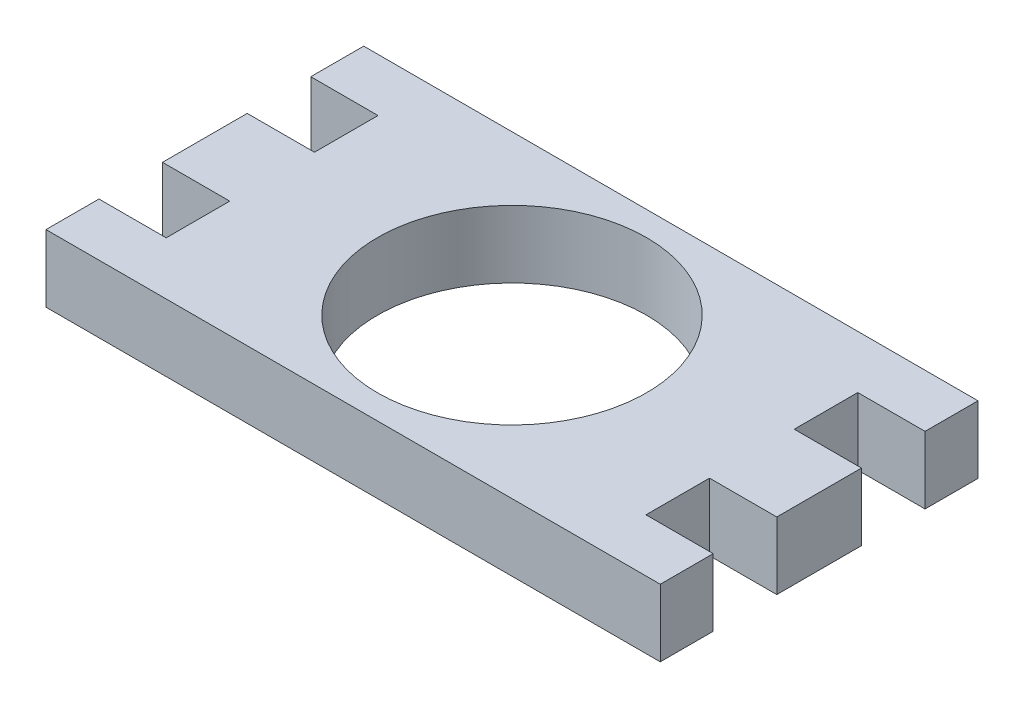
ISO-10303-21;
HEADER;
FILE_DESCRIPTION(('STEP AP214'),'2;1');
FILE_NAME('part.step','',(''),(''),'','','');
FILE_SCHEMA(('AUTOMOTIVE_DESIGN { 1 0 10303 214 1 1 1 1 }'));
ENDSEC;
DATA;
#1=APPLICATION_CONTEXT('core data for automotive mechanical design processes');
#2=APPLICATION_PROTOCOL_DEFINITION('international standard','automotive_design',2000,#1);
#3=PRODUCT_CONTEXT('',#1,'mechanical');
#4=PRODUCT('Part','Part','',(#3));
#5=PRODUCT_RELATED_PRODUCT_CATEGORY('part','',(#4));
#6=PRODUCT_DEFINITION_FORMATION('','',#4);
#7=PRODUCT_DEFINITION_CONTEXT('part definition',#1,'design');
#8=PRODUCT_DEFINITION('design','',#6,#7);
#9=PRODUCT_DEFINITION_SHAPE('','',#8);
#10=(LENGTH_UNIT() NAMED_UNIT(*) SI_UNIT(.MILLI.,.METRE.));
#11=(NAMED_UNIT(*) PLANE_ANGLE_UNIT() SI_UNIT($,.RADIAN.));
#12=(NAMED_UNIT(*) SI_UNIT($,.STERADIAN.) SOLID_ANGLE_UNIT());
#13=UNCERTAINTY_MEASURE_WITH_UNIT(LENGTH_MEASURE(1.E-05),#10,'distance_accuracy_value','');
#14=(GEOMETRIC_REPRESENTATION_CONTEXT(3) GLOBAL_UNCERTAINTY_ASSIGNED_CONTEXT((#13)) GLOBAL_UNIT_ASSIGNED_CONTEXT((#10,
#11,#12)) REPRESENTATION_CONTEXT('',''));
#15=CARTESIAN_POINT('',(0.,0.,0.));
#16=DIRECTION('',(0.,0.,1.));
#17=DIRECTION('',(1.,0.,0.));
#18=AXIS2_PLACEMENT_3D('',#15,#16,#17);
#19=CARTESIAN_POINT('',(0.,6.35,0.));
#20=DIRECTION('',(0.,1.,0.));
#21=DIRECTION('',(0.,0.,1.));
#22=AXIS2_PLACEMENT_3D('',#19,#20,#21);
#23=PLANE('',#22);
#24=DIRECTION('',(0.,0.,-1.));
#25=VECTOR('',#24,1.);
#26=CARTESIAN_POINT('',(29.,6.35,10.));
#27=LINE('',#26,#25);
#28=CARTESIAN_POINT('',(29.,6.35,15.));
#29=VERTEX_POINT('',#28);
#30=CARTESIAN_POINT('',(29.,6.35,10.));
#31=VERTEX_POINT('',#30);
#32=EDGE_CURVE('E241',#29,#31,#27,.T.);
#33=ORIENTED_EDGE('',*,*,#32,.T.);
#34=DIRECTION('',(-1.,0.,0.));
#35=VECTOR('',#34,1.);
#36=CARTESIAN_POINT('',(29.,6.35,10.));
#37=LINE('',#36,#35);
#38=CARTESIAN_POINT('',(22.65,6.35,9.99999999999999));
#39=VERTEX_POINT('',#38);
#40=EDGE_CURVE('E129',#31,#39,#37,.T.);
#41=ORIENTED_EDGE('',*,*,#40,.T.);
#42=DIRECTION('',(0.,0.,-1.));
#43=VECTOR('',#42,1.);
#44=CARTESIAN_POINT('',(22.65,6.35,9.99999999999999));
#45=LINE('',#44,#43);
#46=CARTESIAN_POINT('',(22.65,6.35,3.99999999999999));
#47=VERTEX_POINT('',#46);
#48=EDGE_CURVE('E292',#39,#47,#45,.T.);
#49=ORIENTED_EDGE('',*,*,#48,.T.);
#50=DIRECTION('',(1.,0.,0.));
#51=VECTOR('',#50,1.);
#52=CARTESIAN_POINT('',(22.65,6.35,3.99999999999999));
#53=LINE('',#52,#51);
#54=CARTESIAN_POINT('',(29.,6.35,4.00000000000001));
#55=VERTEX_POINT('',#54);
#56=EDGE_CURVE('E311',#47,#55,#53,.T.);
#57=ORIENTED_EDGE('',*,*,#56,.T.);
#58=DIRECTION('',(0.,0.,-1.));
#59=VECTOR('',#58,1.);
#60=CARTESIAN_POINT('',(29.,6.35,-4.00000000000001));
#61=LINE('',#60,#59);
#62=CARTESIAN_POINT('',(29.,6.35,-4.00000000000001));
#63=VERTEX_POINT('',#62);
#64=EDGE_CURVE('E308',#55,#63,#61,.T.);
#65=ORIENTED_EDGE('',*,*,#64,.T.);
#66=DIRECTION('',(-1.,0.,0.));
#67=VECTOR('',#66,1.);
#68=CARTESIAN_POINT('',(22.65,6.35,-3.99999999999999));
#69=LINE('',#68,#67);
#70=CARTESIAN_POINT('',(22.65,6.35,-3.99999999999999));
#71=VERTEX_POINT('',#70);
#72=EDGE_CURVE('E310',#63,#71,#69,.T.);
#73=ORIENTED_EDGE('',*,*,#72,.T.);
#74=DIRECTION('',(0.,0.,-1.));
#75=VECTOR('',#74,1.);
#76=CARTESIAN_POINT('',(22.65,6.35,-9.99999999999999));
#77=LINE('',#76,#75);
#78=CARTESIAN_POINT('',(22.65,6.35,-9.99999999999999));
#79=VERTEX_POINT('',#78);
#80=EDGE_CURVE('E313',#71,#79,#77,.T.);
#81=ORIENTED_EDGE('',*,*,#80,.T.);
#82=DIRECTION('',(1.,0.,0.));
#83=VECTOR('',#82,1.);
#84=CARTESIAN_POINT('',(29.,6.35,-10.));
#85=LINE('',#84,#83);
#86=CARTESIAN_POINT('',(29.,6.35,-10.));
#87=VERTEX_POINT('',#86);
#88=EDGE_CURVE('E319',#79,#87,#85,.T.);
#89=ORIENTED_EDGE('',*,*,#88,.T.);
#90=DIRECTION('',(0.,0.,-1.));
#91=VECTOR('',#90,1.);
#92=CARTESIAN_POINT('',(29.,6.35,-15.));
#93=LINE('',#92,#91);
#94=CARTESIAN_POINT('',(29.,6.35,-15.));
#95=VERTEX_POINT('',#94);
#96=EDGE_CURVE('E321',#87,#95,#93,.T.);
#97=ORIENTED_EDGE('',*,*,#96,.T.);
#98=DIRECTION('',(-1.,0.,0.));
#99=VECTOR('',#98,1.);
#100=CARTESIAN_POINT('',(-29.,6.35,-15.));
#101=LINE('',#100,#99);
#102=CARTESIAN_POINT('',(-29.,6.35,-15.));
#103=VERTEX_POINT('',#102);
#104=EDGE_CURVE('E323',#95,#103,#101,.T.);
#105=ORIENTED_EDGE('',*,*,#104,.T.);
#106=DIRECTION('',(0.,0.,1.));
#107=VECTOR('',#106,1.);
#108=CARTESIAN_POINT('',(-29.,6.35,-15.));
#109=LINE('',#108,#107);
#110=CARTESIAN_POINT('',(-29.,6.35,-10.));
#111=VERTEX_POINT('',#110);
#112=EDGE_CURVE('E325',#103,#111,#109,.T.);
#113=ORIENTED_EDGE('',*,*,#112,.T.);
#114=DIRECTION('',(1.,0.,0.));
#115=VECTOR('',#114,1.);
#116=CARTESIAN_POINT('',(-29.,6.35,-10.));
#117=LINE('',#116,#115);
#118=CARTESIAN_POINT('',(-22.65,6.35,-10.));
#119=VERTEX_POINT('',#118);
#120=EDGE_CURVE('E327',#111,#119,#117,.T.);
#121=ORIENTED_EDGE('',*,*,#120,.T.);
#122=DIRECTION('',(0.,0.,1.));
#123=VECTOR('',#122,1.);
#124=CARTESIAN_POINT('',(-22.65,6.35,-10.));
#125=LINE('',#124,#123);
#126=CARTESIAN_POINT('',(-22.65,6.35,-4.));
#127=VERTEX_POINT('',#126);
#128=EDGE_CURVE('E329',#119,#127,#125,.T.);
#129=ORIENTED_EDGE('',*,*,#128,.T.);
#130=DIRECTION('',(-1.,0.,0.));
#131=VECTOR('',#130,1.);
#132=CARTESIAN_POINT('',(-22.65,6.35,-4.));
#133=LINE('',#132,#131);
#134=CARTESIAN_POINT('',(-29.,6.35,-4.));
#135=VERTEX_POINT('',#134);
#136=EDGE_CURVE('E331',#127,#135,#133,.T.);
#137=ORIENTED_EDGE('',*,*,#136,.T.);
#138=DIRECTION('',(0.,0.,1.));
#139=VECTOR('',#138,1.);
#140=CARTESIAN_POINT('',(-29.,6.35,-4.));
#141=LINE('',#140,#139);
#142=CARTESIAN_POINT('',(-29.,6.35,4.));
#143=VERTEX_POINT('',#142);
#144=EDGE_CURVE('E333',#135,#143,#141,.T.);
#145=ORIENTED_EDGE('',*,*,#144,.T.);
#146=DIRECTION('',(1.,0.,0.));
#147=VECTOR('',#146,1.);
#148=CARTESIAN_POINT('',(-22.65,6.35,4.));
#149=LINE('',#148,#147);
#150=CARTESIAN_POINT('',(-22.65,6.35,4.));
#151=VERTEX_POINT('',#150);
#152=EDGE_CURVE('E335',#143,#151,#149,.T.);
#153=ORIENTED_EDGE('',*,*,#152,.T.);
#154=DIRECTION('',(0.,0.,1.));
#155=VECTOR('',#154,1.);
#156=CARTESIAN_POINT('',(-22.65,6.35,10.));
#157=LINE('',#156,#155);
#158=CARTESIAN_POINT('',(-22.65,6.35,10.));
#159=VERTEX_POINT('',#158);
#160=EDGE_CURVE('E184',#151,#159,#157,.T.);
#161=ORIENTED_EDGE('',*,*,#160,.T.);
#162=DIRECTION('',(-1.,0.,0.));
#163=VECTOR('',#162,1.);
#164=CARTESIAN_POINT('',(-29.,6.35,10.));
#165=LINE('',#164,#163);
#166=CARTESIAN_POINT('',(-29.,6.35,10.));
#167=VERTEX_POINT('',#166);
#168=EDGE_CURVE('E178',#159,#167,#165,.T.);
#169=ORIENTED_EDGE('',*,*,#168,.T.);
#170=DIRECTION('',(0.,0.,1.));
#171=VECTOR('',#170,1.);
#172=CARTESIAN_POINT('',(-29.,6.35,10.));
#173=LINE('',#172,#171);
#174=CARTESIAN_POINT('',(-29.,6.35,15.));
#175=VERTEX_POINT('',#174);
#176=EDGE_CURVE('E182',#167,#175,#173,.T.);
#177=ORIENTED_EDGE('',*,*,#176,.T.);
#178=DIRECTION('',(1.,0.,0.));
#179=VECTOR('',#178,1.);
#180=CARTESIAN_POINT('',(-29.,6.35,15.));
#181=LINE('',#180,#179);
#182=EDGE_CURVE('E50',#175,#29,#181,.T.);
#183=ORIENTED_EDGE('',*,*,#182,.T.);
#184=EDGE_LOOP('',(#33,#41,#49,#57,#65,#73,#81,#89,#97,#105,#113,#121,#129,#137,#145,#153,#161,
#169,#177,#183));
#185=FACE_BOUND('',#184,.T.);
#186=CARTESIAN_POINT('',(0.,6.35,0.));
#187=DIRECTION('',(0.,1.,0.));
#188=DIRECTION('',(0.,0.,1.));
#189=AXIS2_PLACEMENT_3D('',#186,#187,#188);
#190=CIRCLE('',#189,12.7);
#191=CARTESIAN_POINT('',(0.,6.35,12.7));
#192=VERTEX_POINT('',#191);
#193=EDGE_CURVE('E206',#192,#192,#190,.T.);
#194=ORIENTED_EDGE('',*,*,#193,.F.);
#195=EDGE_LOOP('',(#194));
#196=FACE_BOUND('',#195,.T.);
#197=ADVANCED_FACE('F33',(#185,#196),#23,.T.);
#198=CARTESIAN_POINT('',(0.,0.,0.));
#199=DIRECTION('',(0.,1.,0.));
#200=DIRECTION('',(0.,0.,1.));
#201=AXIS2_PLACEMENT_3D('',#198,#199,#200);
#202=PLANE('',#201);
#203=DIRECTION('',(0.,0.,-1.));
#204=VECTOR('',#203,1.);
#205=CARTESIAN_POINT('',(29.,0.,10.));
#206=LINE('',#205,#204);
#207=CARTESIAN_POINT('',(29.,0.,15.));
#208=VERTEX_POINT('',#207);
#209=CARTESIAN_POINT('',(29.,0.,10.));
#210=VERTEX_POINT('',#209);
#211=EDGE_CURVE('E202',#208,#210,#206,.T.);
#212=ORIENTED_EDGE('',*,*,#211,.F.);
#213=DIRECTION('',(1.,0.,0.));
#214=VECTOR('',#213,1.);
#215=CARTESIAN_POINT('',(-29.,0.,15.));
#216=LINE('',#215,#214);
#217=CARTESIAN_POINT('',(-29.,0.,15.));
#218=VERTEX_POINT('',#217);
#219=EDGE_CURVE('E121',#218,#208,#216,.T.);
#220=ORIENTED_EDGE('',*,*,#219,.F.);
#221=DIRECTION('',(0.,0.,1.));
#222=VECTOR('',#221,1.);
#223=CARTESIAN_POINT('',(-29.,0.,10.));
#224=LINE('',#223,#222);
#225=CARTESIAN_POINT('',(-29.,0.,10.));
#226=VERTEX_POINT('',#225);
#227=EDGE_CURVE('E115',#226,#218,#224,.T.);
#228=ORIENTED_EDGE('',*,*,#227,.F.);
#229=DIRECTION('',(-1.,0.,0.));
#230=VECTOR('',#229,1.);
#231=CARTESIAN_POINT('',(-29.,0.,10.));
#232=LINE('',#231,#230);
#233=CARTESIAN_POINT('',(-22.65,0.,10.));
#234=VERTEX_POINT('',#233);
#235=EDGE_CURVE('E192',#234,#226,#232,.T.);
#236=ORIENTED_EDGE('',*,*,#235,.F.);
#237=DIRECTION('',(0.,0.,1.));
#238=VECTOR('',#237,1.);
#239=CARTESIAN_POINT('',(-22.65,0.,10.));
#240=LINE('',#239,#238);
#241=CARTESIAN_POINT('',(-22.65,0.,4.));
#242=VERTEX_POINT('',#241);
#243=EDGE_CURVE('E236',#242,#234,#240,.T.);
#244=ORIENTED_EDGE('',*,*,#243,.F.);
#245=DIRECTION('',(1.,0.,0.));
#246=VECTOR('',#245,1.);
#247=CARTESIAN_POINT('',(-22.65,0.,4.));
#248=LINE('',#247,#246);
#249=CARTESIAN_POINT('',(-29.,0.,4.));
#250=VERTEX_POINT('',#249);
#251=EDGE_CURVE('E234',#250,#242,#248,.T.);
#252=ORIENTED_EDGE('',*,*,#251,.F.);
#253=DIRECTION('',(0.,0.,1.));
#254=VECTOR('',#253,1.);
#255=CARTESIAN_POINT('',(-29.,0.,-4.));
#256=LINE('',#255,#254);
#257=CARTESIAN_POINT('',(-29.,0.,-4.));
#258=VERTEX_POINT('',#257);
#259=EDGE_CURVE('E232',#258,#250,#256,.T.);
#260=ORIENTED_EDGE('',*,*,#259,.F.);
#261=DIRECTION('',(-1.,0.,0.));
#262=VECTOR('',#261,1.);
#263=CARTESIAN_POINT('',(-22.65,0.,-4.));
#264=LINE('',#263,#262);
#265=CARTESIAN_POINT('',(-22.65,0.,-4.));
#266=VERTEX_POINT('',#265);
#267=EDGE_CURVE('E230',#266,#258,#264,.T.);
#268=ORIENTED_EDGE('',*,*,#267,.F.);
#269=DIRECTION('',(0.,0.,1.));
#270=VECTOR('',#269,1.);
#271=CARTESIAN_POINT('',(-22.65,0.,-10.));
#272=LINE('',#271,#270);
#273=CARTESIAN_POINT('',(-22.65,0.,-10.));
#274=VERTEX_POINT('',#273);
#275=EDGE_CURVE('E228',#274,#266,#272,.T.);
#276=ORIENTED_EDGE('',*,*,#275,.F.);
#277=DIRECTION('',(1.,0.,0.));
#278=VECTOR('',#277,1.);
#279=CARTESIAN_POINT('',(-29.,0.,-10.));
#280=LINE('',#279,#278);
#281=CARTESIAN_POINT('',(-29.,0.,-10.));
#282=VERTEX_POINT('',#281);
#283=EDGE_CURVE('E226',#282,#274,#280,.T.);
#284=ORIENTED_EDGE('',*,*,#283,.F.);
#285=DIRECTION('',(0.,0.,1.));
#286=VECTOR('',#285,1.);
#287=CARTESIAN_POINT('',(-29.,0.,-15.));
#288=LINE('',#287,#286);
#289=CARTESIAN_POINT('',(-29.,0.,-15.));
#290=VERTEX_POINT('',#289);
#291=EDGE_CURVE('E224',#290,#282,#288,.T.);
#292=ORIENTED_EDGE('',*,*,#291,.F.);
#293=DIRECTION('',(-1.,0.,0.));
#294=VECTOR('',#293,1.);
#295=CARTESIAN_POINT('',(-29.,0.,-15.));
#296=LINE('',#295,#294);
#297=CARTESIAN_POINT('',(29.,0.,-15.));
#298=VERTEX_POINT('',#297);
#299=EDGE_CURVE('E222',#298,#290,#296,.T.);
#300=ORIENTED_EDGE('',*,*,#299,.F.);
#301=DIRECTION('',(0.,0.,-1.));
#302=VECTOR('',#301,1.);
#303=CARTESIAN_POINT('',(29.,0.,-15.));
#304=LINE('',#303,#302);
#305=CARTESIAN_POINT('',(29.,0.,-10.));
#306=VERTEX_POINT('',#305);
#307=EDGE_CURVE('E220',#306,#298,#304,.T.);
#308=ORIENTED_EDGE('',*,*,#307,.F.);
#309=DIRECTION('',(1.,0.,0.));
#310=VECTOR('',#309,1.);
#311=CARTESIAN_POINT('',(29.,0.,-10.));
#312=LINE('',#311,#310);
#313=CARTESIAN_POINT('',(22.65,0.,-9.99999999999999));
#314=VERTEX_POINT('',#313);
#315=EDGE_CURVE('E218',#314,#306,#312,.T.);
#316=ORIENTED_EDGE('',*,*,#315,.F.);
#317=DIRECTION('',(0.,0.,-1.));
#318=VECTOR('',#317,1.);
#319=CARTESIAN_POINT('',(22.65,0.,-9.99999999999999));
#320=LINE('',#319,#318);
#321=CARTESIAN_POINT('',(22.65,0.,-3.99999999999999));
#322=VERTEX_POINT('',#321);
#323=EDGE_CURVE('E216',#322,#314,#320,.T.);
#324=ORIENTED_EDGE('',*,*,#323,.F.);
#325=DIRECTION('',(-1.,0.,0.));
#326=VECTOR('',#325,1.);
#327=CARTESIAN_POINT('',(22.65,0.,-3.99999999999999));
#328=LINE('',#327,#326);
#329=CARTESIAN_POINT('',(29.,0.,-4.00000000000001));
#330=VERTEX_POINT('',#329);
#331=EDGE_CURVE('E214',#330,#322,#328,.T.);
#332=ORIENTED_EDGE('',*,*,#331,.F.);
#333=DIRECTION('',(0.,0.,-1.));
#334=VECTOR('',#333,1.);
#335=CARTESIAN_POINT('',(29.,0.,-4.00000000000001));
#336=LINE('',#335,#334);
#337=CARTESIAN_POINT('',(29.,0.,4.00000000000001));
#338=VERTEX_POINT('',#337);
#339=EDGE_CURVE('E212',#338,#330,#336,.T.);
#340=ORIENTED_EDGE('',*,*,#339,.F.);
#341=DIRECTION('',(1.,0.,0.));
#342=VECTOR('',#341,1.);
#343=CARTESIAN_POINT('',(22.65,0.,3.99999999999999));
#344=LINE('',#343,#342);
#345=CARTESIAN_POINT('',(22.65,0.,3.99999999999999));
#346=VERTEX_POINT('',#345);
#347=EDGE_CURVE('E210',#346,#338,#344,.T.);
#348=ORIENTED_EDGE('',*,*,#347,.F.);
#349=DIRECTION('',(0.,0.,-1.));
#350=VECTOR('',#349,1.);
#351=CARTESIAN_POINT('',(22.65,0.,9.99999999999999));
#352=LINE('',#351,#350);
#353=CARTESIAN_POINT('',(22.65,0.,9.99999999999999));
#354=VERTEX_POINT('',#353);
#355=EDGE_CURVE('E208',#354,#346,#352,.T.);
#356=ORIENTED_EDGE('',*,*,#355,.F.);
#357=DIRECTION('',(-1.,0.,0.));
#358=VECTOR('',#357,1.);
#359=CARTESIAN_POINT('',(29.,0.,10.));
#360=LINE('',#359,#358);
#361=EDGE_CURVE('E205',#210,#354,#360,.T.);
#362=ORIENTED_EDGE('',*,*,#361,.F.);
#363=EDGE_LOOP('',(#212,#220,#228,#236,#244,#252,#260,#268,#276,#284,#292,#300,#308,#316,#324,
#332,#340,#348,#356,#362));
#364=FACE_BOUND('',#363,.T.);
#365=CARTESIAN_POINT('',(0.,0.,0.));
#366=DIRECTION('',(0.,1.,0.));
#367=DIRECTION('',(0.,0.,1.));
#368=AXIS2_PLACEMENT_3D('',#365,#366,#367);
#369=CIRCLE('',#368,12.7);
#370=CARTESIAN_POINT('',(0.,0.,12.7));
#371=VERTEX_POINT('',#370);
#372=EDGE_CURVE('E586',#371,#371,#369,.T.);
#373=ORIENTED_EDGE('',*,*,#372,.T.);
#374=EDGE_LOOP('',(#373));
#375=FACE_BOUND('',#374,.T.);
#376=ADVANCED_FACE('F296',(#364,#375),#202,.F.);
#377=CARTESIAN_POINT('',(29.,6.35,10.));
#378=DIRECTION('',(-1.,0.,0.));
#379=DIRECTION('',(0.,0.,1.));
#380=AXIS2_PLACEMENT_3D('',#377,#378,#379);
#381=PLANE('',#380);
#382=ORIENTED_EDGE('',*,*,#211,.T.);
#383=DIRECTION('',(0.,-1.,0.));
#384=VECTOR('',#383,1.);
#385=CARTESIAN_POINT('',(29.,6.35,10.));
#386=LINE('',#385,#384);
#387=EDGE_CURVE('E11',#31,#210,#386,.T.);
#388=ORIENTED_EDGE('',*,*,#387,.F.);
#389=ORIENTED_EDGE('',*,*,#32,.F.);
#390=DIRECTION('',(0.,-1.,0.));
#391=VECTOR('',#390,1.);
#392=CARTESIAN_POINT('',(29.,6.35,15.));
#393=LINE('',#392,#391);
#394=EDGE_CURVE('E198',#29,#208,#393,.T.);
#395=ORIENTED_EDGE('',*,*,#394,.T.);
#396=EDGE_LOOP('',(#382,#388,#389,#395));
#397=FACE_BOUND('',#396,.T.);
#398=ADVANCED_FACE('F35',(#397),#381,.F.);
#399=CARTESIAN_POINT('',(29.,6.35,10.));
#400=DIRECTION('',(0.,0.,1.));
#401=DIRECTION('',(1.,0.,0.));
#402=AXIS2_PLACEMENT_3D('',#399,#400,#401);
#403=PLANE('',#402);
#404=ORIENTED_EDGE('',*,*,#361,.T.);
#405=DIRECTION('',(0.,-1.,0.));
#406=VECTOR('',#405,1.);
#407=CARTESIAN_POINT('',(22.65,6.35,9.99999999999999));
#408=LINE('',#407,#406);
#409=EDGE_CURVE('E42',#39,#354,#408,.T.);
#410=ORIENTED_EDGE('',*,*,#409,.F.);
#411=ORIENTED_EDGE('',*,*,#40,.F.);
#412=ORIENTED_EDGE('',*,*,#387,.T.);
#413=EDGE_LOOP('',(#404,#410,#411,#412));
#414=FACE_BOUND('',#413,.T.);
#415=ADVANCED_FACE('F369',(#414),#403,.F.);
#416=CARTESIAN_POINT('',(22.65,6.35,9.99999999999999));
#417=DIRECTION('',(-1.,0.,0.));
#418=DIRECTION('',(0.,0.,1.));
#419=AXIS2_PLACEMENT_3D('',#416,#417,#418);
#420=PLANE('',#419);
#421=ORIENTED_EDGE('',*,*,#355,.T.);
#422=DIRECTION('',(0.,-1.,0.));
#423=VECTOR('',#422,1.);
#424=CARTESIAN_POINT('',(22.65,6.35,3.99999999999999));
#425=LINE('',#424,#423);
#426=EDGE_CURVE('E284',#47,#346,#425,.T.);
#427=ORIENTED_EDGE('',*,*,#426,.F.);
#428=ORIENTED_EDGE('',*,*,#48,.F.);
#429=ORIENTED_EDGE('',*,*,#409,.T.);
#430=EDGE_LOOP('',(#421,#427,#428,#429));
#431=FACE_BOUND('',#430,.T.);
#432=ADVANCED_FACE('F290',(#431),#420,.F.);
#433=CARTESIAN_POINT('',(22.65,6.35,3.99999999999999));
#434=DIRECTION('',(0.,0.,-1.));
#435=DIRECTION('',(-1.,0.,0.));
#436=AXIS2_PLACEMENT_3D('',#433,#434,#435);
#437=PLANE('',#436);
#438=ORIENTED_EDGE('',*,*,#347,.T.);
#439=DIRECTION('',(0.,-1.,0.));
#440=VECTOR('',#439,1.);
#441=CARTESIAN_POINT('',(29.,6.35,4.00000000000001));
#442=LINE('',#441,#440);
#443=EDGE_CURVE('E281',#55,#338,#442,.T.);
#444=ORIENTED_EDGE('',*,*,#443,.F.);
#445=ORIENTED_EDGE('',*,*,#56,.F.);
#446=ORIENTED_EDGE('',*,*,#426,.T.);
#447=EDGE_LOOP('',(#438,#444,#445,#446));
#448=FACE_BOUND('',#447,.T.);
#449=ADVANCED_FACE('F302',(#448),#437,.F.);
#450=CARTESIAN_POINT('',(29.,6.35,-4.00000000000001));
#451=DIRECTION('',(-1.,0.,0.));
#452=DIRECTION('',(0.,0.,1.));
#453=AXIS2_PLACEMENT_3D('',#450,#451,#452);
#454=PLANE('',#453);
#455=ORIENTED_EDGE('',*,*,#339,.T.);
#456=DIRECTION('',(0.,-1.,0.));
#457=VECTOR('',#456,1.);
#458=CARTESIAN_POINT('',(29.,6.35,-4.00000000000001));
#459=LINE('',#458,#457);
#460=EDGE_CURVE('E278',#63,#330,#459,.T.);
#461=ORIENTED_EDGE('',*,*,#460,.F.);
#462=ORIENTED_EDGE('',*,*,#64,.F.);
#463=ORIENTED_EDGE('',*,*,#443,.T.);
#464=EDGE_LOOP('',(#455,#461,#462,#463));
#465=FACE_BOUND('',#464,.T.);
#466=ADVANCED_FACE('F306',(#465),#454,.F.);
#467=CARTESIAN_POINT('',(22.65,6.35,-3.99999999999999));
#468=DIRECTION('',(0.,0.,1.));
#469=DIRECTION('',(1.,0.,0.));
#470=AXIS2_PLACEMENT_3D('',#467,#468,#469);
#471=PLANE('',#470);
#472=ORIENTED_EDGE('',*,*,#331,.T.);
#473=DIRECTION('',(0.,-1.,0.));
#474=VECTOR('',#473,1.);
#475=CARTESIAN_POINT('',(22.65,6.35,-3.99999999999999));
#476=LINE('',#475,#474);
#477=EDGE_CURVE('E275',#71,#322,#476,.T.);
#478=ORIENTED_EDGE('',*,*,#477,.F.);
#479=ORIENTED_EDGE('',*,*,#72,.F.);
#480=ORIENTED_EDGE('',*,*,#460,.T.);
#481=EDGE_LOOP('',(#472,#478,#479,#480));
#482=FACE_BOUND('',#481,.T.);
#483=ADVANCED_FACE('F382',(#482),#471,.F.);
#484=CARTESIAN_POINT('',(22.65,6.35,-9.99999999999999));
#485=DIRECTION('',(-1.,0.,0.));
#486=DIRECTION('',(0.,0.,1.));
#487=AXIS2_PLACEMENT_3D('',#484,#485,#486);
#488=PLANE('',#487);
#489=ORIENTED_EDGE('',*,*,#323,.T.);
#490=DIRECTION('',(0.,-1.,0.));
#491=VECTOR('',#490,1.);
#492=CARTESIAN_POINT('',(22.65,6.35,-9.99999999999999));
#493=LINE('',#492,#491);
#494=EDGE_CURVE('E272',#79,#314,#493,.T.);
#495=ORIENTED_EDGE('',*,*,#494,.F.);
#496=ORIENTED_EDGE('',*,*,#80,.F.);
#497=ORIENTED_EDGE('',*,*,#477,.T.);
#498=EDGE_LOOP('',(#489,#495,#496,#497));
#499=FACE_BOUND('',#498,.T.);
#500=ADVANCED_FACE('F385',(#499),#488,.F.);
#501=CARTESIAN_POINT('',(29.,6.35,-10.));
#502=DIRECTION('',(0.,0.,-1.));
#503=DIRECTION('',(-1.,0.,0.));
#504=AXIS2_PLACEMENT_3D('',#501,#502,#503);
#505=PLANE('',#504);
#506=ORIENTED_EDGE('',*,*,#315,.T.);
#507=DIRECTION('',(0.,-1.,0.));
#508=VECTOR('',#507,1.);
#509=CARTESIAN_POINT('',(29.,6.35,-10.));
#510=LINE('',#509,#508);
#511=EDGE_CURVE('E269',#87,#306,#510,.T.);
#512=ORIENTED_EDGE('',*,*,#511,.F.);
#513=ORIENTED_EDGE('',*,*,#88,.F.);
#514=ORIENTED_EDGE('',*,*,#494,.T.);
#515=EDGE_LOOP('',(#506,#512,#513,#514));
#516=FACE_BOUND('',#515,.T.);
#517=ADVANCED_FACE('F389',(#516),#505,.F.);
#518=CARTESIAN_POINT('',(29.,6.35,-15.));
#519=DIRECTION('',(-1.,0.,0.));
#520=DIRECTION('',(0.,0.,1.));
#521=AXIS2_PLACEMENT_3D('',#518,#519,#520);
#522=PLANE('',#521);
#523=ORIENTED_EDGE('',*,*,#307,.T.);
#524=DIRECTION('',(0.,-1.,0.));
#525=VECTOR('',#524,1.);
#526=CARTESIAN_POINT('',(29.,6.35,-15.));
#527=LINE('',#526,#525);
#528=EDGE_CURVE('E266',#95,#298,#527,.T.);
#529=ORIENTED_EDGE('',*,*,#528,.F.);
#530=ORIENTED_EDGE('',*,*,#96,.F.);
#531=ORIENTED_EDGE('',*,*,#511,.T.);
#532=EDGE_LOOP('',(#523,#529,#530,#531));
#533=FACE_BOUND('',#532,.T.);
#534=ADVANCED_FACE('F393',(#533),#522,.F.);
#535=CARTESIAN_POINT('',(-29.,6.35,-15.));
#536=DIRECTION('',(0.,0.,1.));
#537=DIRECTION('',(1.,0.,0.));
#538=AXIS2_PLACEMENT_3D('',#535,#536,#537);
#539=PLANE('',#538);
#540=ORIENTED_EDGE('',*,*,#299,.T.);
#541=DIRECTION('',(0.,-1.,0.));
#542=VECTOR('',#541,1.);
#543=CARTESIAN_POINT('',(-29.,6.35,-15.));
#544=LINE('',#543,#542);
#545=EDGE_CURVE('E263',#103,#290,#544,.T.);
#546=ORIENTED_EDGE('',*,*,#545,.F.);
#547=ORIENTED_EDGE('',*,*,#104,.F.);
#548=ORIENTED_EDGE('',*,*,#528,.T.);
#549=EDGE_LOOP('',(#540,#546,#547,#548));
#550=FACE_BOUND('',#549,.T.);
#551=ADVANCED_FACE('F397',(#550),#539,.F.);
#552=CARTESIAN_POINT('',(-29.,6.35,-15.));
#553=DIRECTION('',(1.,0.,0.));
#554=DIRECTION('',(0.,0.,-1.));
#555=AXIS2_PLACEMENT_3D('',#552,#553,#554);
#556=PLANE('',#555);
#557=ORIENTED_EDGE('',*,*,#291,.T.);
#558=DIRECTION('',(0.,-1.,0.));
#559=VECTOR('',#558,1.);
#560=CARTESIAN_POINT('',(-29.,6.35,-10.));
#561=LINE('',#560,#559);
#562=EDGE_CURVE('E260',#111,#282,#561,.T.);
#563=ORIENTED_EDGE('',*,*,#562,.F.);
#564=ORIENTED_EDGE('',*,*,#112,.F.);
#565=ORIENTED_EDGE('',*,*,#545,.T.);
#566=EDGE_LOOP('',(#557,#563,#564,#565));
#567=FACE_BOUND('',#566,.T.);
#568=ADVANCED_FACE('F401',(#567),#556,.F.);
#569=CARTESIAN_POINT('',(-29.,6.35,-10.));
#570=DIRECTION('',(0.,0.,-1.));
#571=DIRECTION('',(-1.,0.,0.));
#572=AXIS2_PLACEMENT_3D('',#569,#570,#571);
#573=PLANE('',#572);
#574=ORIENTED_EDGE('',*,*,#283,.T.);
#575=DIRECTION('',(0.,-1.,0.));
#576=VECTOR('',#575,1.);
#577=CARTESIAN_POINT('',(-22.65,6.35,-10.));
#578=LINE('',#577,#576);
#579=EDGE_CURVE('E257',#119,#274,#578,.T.);
#580=ORIENTED_EDGE('',*,*,#579,.F.);
#581=ORIENTED_EDGE('',*,*,#120,.F.);
#582=ORIENTED_EDGE('',*,*,#562,.T.);
#583=EDGE_LOOP('',(#574,#580,#581,#582));
#584=FACE_BOUND('',#583,.T.);
#585=ADVANCED_FACE('F405',(#584),#573,.F.);
#586=CARTESIAN_POINT('',(-22.65,6.35,-10.));
#587=DIRECTION('',(1.,0.,0.));
#588=DIRECTION('',(0.,0.,-1.));
#589=AXIS2_PLACEMENT_3D('',#586,#587,#588);
#590=PLANE('',#589);
#591=ORIENTED_EDGE('',*,*,#275,.T.);
#592=DIRECTION('',(0.,-1.,0.));
#593=VECTOR('',#592,1.);
#594=CARTESIAN_POINT('',(-22.65,6.35,-4.));
#595=LINE('',#594,#593);
#596=EDGE_CURVE('E254',#127,#266,#595,.T.);
#597=ORIENTED_EDGE('',*,*,#596,.F.);
#598=ORIENTED_EDGE('',*,*,#128,.F.);
#599=ORIENTED_EDGE('',*,*,#579,.T.);
#600=EDGE_LOOP('',(#591,#597,#598,#599));
#601=FACE_BOUND('',#600,.T.);
#602=ADVANCED_FACE('F409',(#601),#590,.F.);
#603=CARTESIAN_POINT('',(-22.65,6.35,-4.));
#604=DIRECTION('',(0.,0.,1.));
#605=DIRECTION('',(1.,0.,0.));
#606=AXIS2_PLACEMENT_3D('',#603,#604,#605);
#607=PLANE('',#606);
#608=ORIENTED_EDGE('',*,*,#267,.T.);
#609=DIRECTION('',(0.,-1.,0.));
#610=VECTOR('',#609,1.);
#611=CARTESIAN_POINT('',(-29.,6.35,-4.));
#612=LINE('',#611,#610);
#613=EDGE_CURVE('E251',#135,#258,#612,.T.);
#614=ORIENTED_EDGE('',*,*,#613,.F.);
#615=ORIENTED_EDGE('',*,*,#136,.F.);
#616=ORIENTED_EDGE('',*,*,#596,.T.);
#617=EDGE_LOOP('',(#608,#614,#615,#616));
#618=FACE_BOUND('',#617,.T.);
#619=ADVANCED_FACE('F413',(#618),#607,.F.);
#620=CARTESIAN_POINT('',(-29.,6.35,-4.));
#621=DIRECTION('',(1.,0.,0.));
#622=DIRECTION('',(0.,0.,-1.));
#623=AXIS2_PLACEMENT_3D('',#620,#621,#622);
#624=PLANE('',#623);
#625=ORIENTED_EDGE('',*,*,#259,.T.);
#626=DIRECTION('',(0.,-1.,0.));
#627=VECTOR('',#626,1.);
#628=CARTESIAN_POINT('',(-29.,6.35,4.));
#629=LINE('',#628,#627);
#630=EDGE_CURVE('E248',#143,#250,#629,.T.);
#631=ORIENTED_EDGE('',*,*,#630,.F.);
#632=ORIENTED_EDGE('',*,*,#144,.F.);
#633=ORIENTED_EDGE('',*,*,#613,.T.);
#634=EDGE_LOOP('',(#625,#631,#632,#633));
#635=FACE_BOUND('',#634,.T.);
#636=ADVANCED_FACE('F417',(#635),#624,.F.);
#637=CARTESIAN_POINT('',(-22.65,6.35,4.));
#638=DIRECTION('',(0.,0.,-1.));
#639=DIRECTION('',(-1.,0.,0.));
#640=AXIS2_PLACEMENT_3D('',#637,#638,#639);
#641=PLANE('',#640);
#642=ORIENTED_EDGE('',*,*,#251,.T.);
#643=DIRECTION('',(0.,-1.,0.));
#644=VECTOR('',#643,1.);
#645=CARTESIAN_POINT('',(-22.65,6.35,4.));
#646=LINE('',#645,#644);
#647=EDGE_CURVE('E245',#151,#242,#646,.T.);
#648=ORIENTED_EDGE('',*,*,#647,.F.);
#649=ORIENTED_EDGE('',*,*,#152,.F.);
#650=ORIENTED_EDGE('',*,*,#630,.T.);
#651=EDGE_LOOP('',(#642,#648,#649,#650));
#652=FACE_BOUND('',#651,.T.);
#653=ADVANCED_FACE('F341',(#652),#641,.F.);
#654=CARTESIAN_POINT('',(-22.65,6.35,10.));
#655=DIRECTION('',(1.,0.,0.));
#656=DIRECTION('',(0.,0.,-1.));
#657=AXIS2_PLACEMENT_3D('',#654,#655,#656);
#658=PLANE('',#657);
#659=ORIENTED_EDGE('',*,*,#243,.T.);
#660=DIRECTION('',(0.,-1.,0.));
#661=VECTOR('',#660,1.);
#662=CARTESIAN_POINT('',(-22.65,6.35,10.));
#663=LINE('',#662,#661);
#664=EDGE_CURVE('E193',#159,#234,#663,.T.);
#665=ORIENTED_EDGE('',*,*,#664,.F.);
#666=ORIENTED_EDGE('',*,*,#160,.F.);
#667=ORIENTED_EDGE('',*,*,#647,.T.);
#668=EDGE_LOOP('',(#659,#665,#666,#667));
#669=FACE_BOUND('',#668,.T.);
#670=ADVANCED_FACE('F345',(#669),#658,.F.);
#671=CARTESIAN_POINT('',(-29.,6.35,10.));
#672=DIRECTION('',(0.,0.,1.));
#673=DIRECTION('',(1.,0.,0.));
#674=AXIS2_PLACEMENT_3D('',#671,#672,#673);
#675=PLANE('',#674);
#676=ORIENTED_EDGE('',*,*,#235,.T.);
#677=DIRECTION('',(0.,-1.,0.));
#678=VECTOR('',#677,1.);
#679=CARTESIAN_POINT('',(-29.,6.35,10.));
#680=LINE('',#679,#678);
#681=EDGE_CURVE('E189',#167,#226,#680,.T.);
#682=ORIENTED_EDGE('',*,*,#681,.F.);
#683=ORIENTED_EDGE('',*,*,#168,.F.);
#684=ORIENTED_EDGE('',*,*,#664,.T.);
#685=EDGE_LOOP('',(#676,#682,#683,#684));
#686=FACE_BOUND('',#685,.T.);
#687=ADVANCED_FACE('F190',(#686),#675,.F.);
#688=CARTESIAN_POINT('',(-29.,6.35,10.));
#689=DIRECTION('',(1.,0.,0.));
#690=DIRECTION('',(0.,0.,-1.));
#691=AXIS2_PLACEMENT_3D('',#688,#689,#690);
#692=PLANE('',#691);
#693=ORIENTED_EDGE('',*,*,#227,.T.);
#694=DIRECTION('',(0.,-1.,0.));
#695=VECTOR('',#694,1.);
#696=CARTESIAN_POINT('',(-29.,6.35,15.));
#697=LINE('',#696,#695);
#698=EDGE_CURVE('E194',#175,#218,#697,.T.);
#699=ORIENTED_EDGE('',*,*,#698,.F.);
#700=ORIENTED_EDGE('',*,*,#176,.F.);
#701=ORIENTED_EDGE('',*,*,#681,.T.);
#702=EDGE_LOOP('',(#693,#699,#700,#701));
#703=FACE_BOUND('',#702,.T.);
#704=ADVANCED_FACE('F196',(#703),#692,.F.);
#705=CARTESIAN_POINT('',(-29.,6.35,15.));
#706=DIRECTION('',(0.,0.,-1.));
#707=DIRECTION('',(-1.,0.,0.));
#708=AXIS2_PLACEMENT_3D('',#705,#706,#707);
#709=PLANE('',#708);
#710=ORIENTED_EDGE('',*,*,#219,.T.);
#711=ORIENTED_EDGE('',*,*,#394,.F.);
#712=ORIENTED_EDGE('',*,*,#182,.F.);
#713=ORIENTED_EDGE('',*,*,#698,.T.);
#714=EDGE_LOOP('',(#710,#711,#712,#713));
#715=FACE_BOUND('',#714,.T.);
#716=ADVANCED_FACE('F349',(#715),#709,.F.);
#717=CARTESIAN_POINT('',(0.,6.35,0.));
#718=DIRECTION('',(0.,-1.,0.));
#719=DIRECTION('',(0.,0.,-1.));
#720=AXIS2_PLACEMENT_3D('',#717,#718,#719);
#721=CYLINDRICAL_SURFACE('',#720,12.7);
#722=ORIENTED_EDGE('',*,*,#193,.T.);
#723=EDGE_LOOP('',(#722));
#724=FACE_BOUND('',#723,.T.);
#725=ORIENTED_EDGE('',*,*,#372,.F.);
#726=EDGE_LOOP('',(#725));
#727=FACE_BOUND('',#726,.T.);
#728=ADVANCED_FACE('F351',(#724,#727),#721,.F.);
#729=CLOSED_SHELL('',(#197,#376,#398,#415,#432,#449,#466,#483,#500,#517,#534,#551,#568,#585,
#602,#619,#636,#653,#670,#687,#704,#716,#728));
#730=MANIFOLD_SOLID_BREP('B2',#729);
#731=ADVANCED_BREP_SHAPE_REPRESENTATION('',(#18,#730),#14);
#732=SHAPE_DEFINITION_REPRESENTATION(#9,#731);
ENDSEC;
END-ISO-10303-21;
